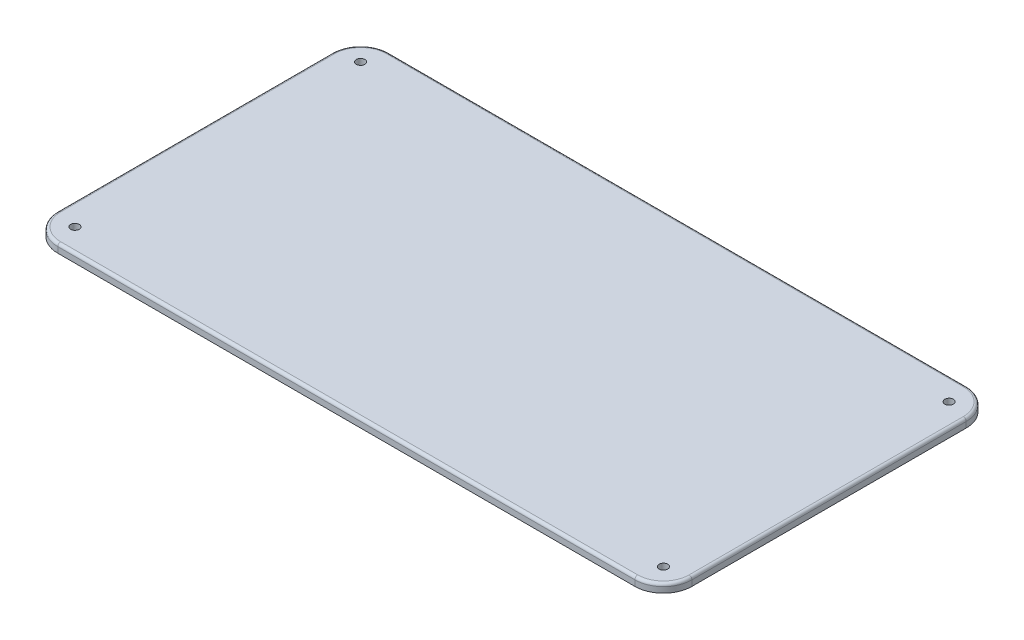
ISO-10303-21;
HEADER;
FILE_DESCRIPTION(('STEP AP214'),'2;1');
FILE_NAME('part.step','',(''),(''),'','','');
FILE_SCHEMA(('AUTOMOTIVE_DESIGN { 1 0 10303 214 1 1 1 1 }'));
ENDSEC;
DATA;
#1=APPLICATION_CONTEXT('core data for automotive mechanical design processes');
#2=APPLICATION_PROTOCOL_DEFINITION('international standard','automotive_design',2000,#1);
#3=PRODUCT_CONTEXT('',#1,'mechanical');
#4=PRODUCT('Part','Part','',(#3));
#5=PRODUCT_RELATED_PRODUCT_CATEGORY('part','',(#4));
#6=PRODUCT_DEFINITION_FORMATION('','',#4);
#7=PRODUCT_DEFINITION_CONTEXT('part definition',#1,'design');
#8=PRODUCT_DEFINITION('design','',#6,#7);
#9=PRODUCT_DEFINITION_SHAPE('','',#8);
#10=(LENGTH_UNIT() NAMED_UNIT(*) SI_UNIT(.MILLI.,.METRE.));
#11=(NAMED_UNIT(*) PLANE_ANGLE_UNIT() SI_UNIT($,.RADIAN.));
#12=(NAMED_UNIT(*) SI_UNIT($,.STERADIAN.) SOLID_ANGLE_UNIT());
#13=UNCERTAINTY_MEASURE_WITH_UNIT(LENGTH_MEASURE(1.E-05),#10,'distance_accuracy_value','');
#14=(GEOMETRIC_REPRESENTATION_CONTEXT(3) GLOBAL_UNCERTAINTY_ASSIGNED_CONTEXT((#13)) GLOBAL_UNIT_ASSIGNED_CONTEXT((#10,
#11,#12)) REPRESENTATION_CONTEXT('',''));
#15=CARTESIAN_POINT('',(0.,0.,0.));
#16=DIRECTION('',(0.,0.,1.));
#17=DIRECTION('',(1.,0.,0.));
#18=AXIS2_PLACEMENT_3D('',#15,#16,#17);
#19=CARTESIAN_POINT('',(7.00000000000006,60.,7.00000000000003));
#20=DIRECTION('',(0.,1.,0.));
#21=DIRECTION('',(0.,0.,1.));
#22=AXIS2_PLACEMENT_3D('',#19,#20,#21);
#23=PLANE('',#22);
#24=DIRECTION('',(0.,0.,1.));
#25=VECTOR('',#24,1.);
#26=CARTESIAN_POINT('',(-204.,60.,7.00000000000004));
#27=LINE('',#26,#25);
#28=CARTESIAN_POINT('',(-204.,60.,-89.));
#29=VERTEX_POINT('',#28);
#30=CARTESIAN_POINT('',(-204.,60.,7.00000000000004));
#31=VERTEX_POINT('',#30);
#32=EDGE_CURVE('E191',#29,#31,#27,.T.);
#33=ORIENTED_EDGE('',*,*,#32,.T.);
#34=CARTESIAN_POINT('',(-195.,60.,7.00000000000004));
#35=DIRECTION('',(0.,1.,0.));
#36=DIRECTION('',(0.,0.,1.));
#37=AXIS2_PLACEMENT_3D('',#34,#35,#36);
#38=CIRCLE('',#37,9.00000000000001);
#39=CARTESIAN_POINT('',(-195.,60.,16.));
#40=VERTEX_POINT('',#39);
#41=EDGE_CURVE('E193',#31,#40,#38,.T.);
#42=ORIENTED_EDGE('',*,*,#41,.T.);
#43=DIRECTION('',(1.,0.,0.));
#44=VECTOR('',#43,1.);
#45=CARTESIAN_POINT('',(7.00000000000006,60.,16.));
#46=LINE('',#45,#44);
#47=CARTESIAN_POINT('',(7.00000000000006,60.,16.));
#48=VERTEX_POINT('',#47);
#49=EDGE_CURVE('E129',#40,#48,#46,.T.);
#50=ORIENTED_EDGE('',*,*,#49,.T.);
#51=CARTESIAN_POINT('',(7.00000000000006,60.,7.00000000000003));
#52=DIRECTION('',(0.,1.,0.));
#53=DIRECTION('',(0.,0.,1.));
#54=AXIS2_PLACEMENT_3D('',#51,#52,#53);
#55=CIRCLE('',#54,9.);
#56=CARTESIAN_POINT('',(16.0000000000001,60.,7.00000000000003));
#57=VERTEX_POINT('',#56);
#58=EDGE_CURVE('E181',#48,#57,#55,.T.);
#59=ORIENTED_EDGE('',*,*,#58,.T.);
#60=DIRECTION('',(0.,0.,-1.));
#61=VECTOR('',#60,1.);
#62=CARTESIAN_POINT('',(16.0000000000001,60.,-89.));
#63=LINE('',#62,#61);
#64=CARTESIAN_POINT('',(16.0000000000001,60.,-89.));
#65=VERTEX_POINT('',#64);
#66=EDGE_CURVE('E183',#57,#65,#63,.T.);
#67=ORIENTED_EDGE('',*,*,#66,.T.);
#68=CARTESIAN_POINT('',(7.00000000000006,60.,-89.));
#69=DIRECTION('',(0.,1.,0.));
#70=DIRECTION('',(0.,0.,1.));
#71=AXIS2_PLACEMENT_3D('',#68,#69,#70);
#72=CIRCLE('',#71,9.);
#73=CARTESIAN_POINT('',(7.00000000000006,60.,-98.));
#74=VERTEX_POINT('',#73);
#75=EDGE_CURVE('E185',#65,#74,#72,.T.);
#76=ORIENTED_EDGE('',*,*,#75,.T.);
#77=DIRECTION('',(-1.,0.,0.));
#78=VECTOR('',#77,1.);
#79=CARTESIAN_POINT('',(-195.,60.,-98.));
#80=LINE('',#79,#78);
#81=CARTESIAN_POINT('',(-195.,60.,-98.));
#82=VERTEX_POINT('',#81);
#83=EDGE_CURVE('E187',#74,#82,#80,.T.);
#84=ORIENTED_EDGE('',*,*,#83,.T.);
#85=CARTESIAN_POINT('',(-195.,60.,-89.));
#86=DIRECTION('',(0.,1.,0.));
#87=DIRECTION('',(0.,0.,1.));
#88=AXIS2_PLACEMENT_3D('',#85,#86,#87);
#89=CIRCLE('',#88,9.);
#90=EDGE_CURVE('E189',#82,#29,#89,.T.);
#91=ORIENTED_EDGE('',*,*,#90,.T.);
#92=EDGE_LOOP('',(#33,#42,#50,#59,#67,#76,#84,#91));
#93=FACE_BOUND('',#92,.T.);
#94=CARTESIAN_POINT('',(9.00000000000007,60.,9.00000000000004));
#95=DIRECTION('',(0.,1.,0.));
#96=DIRECTION('',(0.,0.,1.));
#97=AXIS2_PLACEMENT_3D('',#94,#95,#96);
#98=CIRCLE('',#97,1.5);
#99=CARTESIAN_POINT('',(9.00000000000007,60.,10.5));
#100=VERTEX_POINT('',#99);
#101=EDGE_CURVE('E244',#100,#100,#98,.T.);
#102=ORIENTED_EDGE('',*,*,#101,.F.);
#103=EDGE_LOOP('',(#102));
#104=FACE_BOUND('',#103,.T.);
#105=CARTESIAN_POINT('',(-197.,60.,-91.));
#106=DIRECTION('',(0.,1.,0.));
#107=DIRECTION('',(0.,0.,1.));
#108=AXIS2_PLACEMENT_3D('',#105,#106,#107);
#109=CIRCLE('',#108,1.5);
#110=CARTESIAN_POINT('',(-197.,60.,-89.5));
#111=VERTEX_POINT('',#110);
#112=EDGE_CURVE('E147',#111,#111,#109,.T.);
#113=ORIENTED_EDGE('',*,*,#112,.F.);
#114=EDGE_LOOP('',(#113));
#115=FACE_BOUND('',#114,.T.);
#116=CARTESIAN_POINT('',(9.00000000000007,60.,-91.));
#117=DIRECTION('',(0.,1.,0.));
#118=DIRECTION('',(0.,0.,1.));
#119=AXIS2_PLACEMENT_3D('',#116,#117,#118);
#120=CIRCLE('',#119,1.5);
#121=CARTESIAN_POINT('',(9.00000000000007,60.,-89.5));
#122=VERTEX_POINT('',#121);
#123=EDGE_CURVE('E250',#122,#122,#120,.T.);
#124=ORIENTED_EDGE('',*,*,#123,.F.);
#125=EDGE_LOOP('',(#124));
#126=FACE_BOUND('',#125,.T.);
#127=CARTESIAN_POINT('',(-197.,60.,9.00000000000004));
#128=DIRECTION('',(0.,1.,0.));
#129=DIRECTION('',(0.,0.,1.));
#130=AXIS2_PLACEMENT_3D('',#127,#128,#129);
#131=CIRCLE('',#130,1.5);
#132=CARTESIAN_POINT('',(-197.,60.,10.5));
#133=VERTEX_POINT('',#132);
#134=EDGE_CURVE('E236',#133,#133,#131,.T.);
#135=ORIENTED_EDGE('',*,*,#134,.F.);
#136=EDGE_LOOP('',(#135));
#137=FACE_BOUND('',#136,.T.);
#138=ADVANCED_FACE('F33',(#93,#104,#115,#126,#137),#23,.T.);
#139=CARTESIAN_POINT('',(7.00000000000006,57.,7.00000000000003));
#140=DIRECTION('',(0.,1.,0.));
#141=DIRECTION('',(0.,0.,1.));
#142=AXIS2_PLACEMENT_3D('',#139,#140,#141);
#143=PLANE('',#142);
#144=CARTESIAN_POINT('',(7.00000000000006,57.,7.00000000000003));
#145=DIRECTION('',(0.,1.,0.));
#146=DIRECTION('',(0.,0.,1.));
#147=AXIS2_PLACEMENT_3D('',#144,#145,#146);
#148=CIRCLE('',#147,10.);
#149=CARTESIAN_POINT('',(7.00000000000006,57.,17.));
#150=VERTEX_POINT('',#149);
#151=CARTESIAN_POINT('',(17.0000000000001,57.,7.00000000000003));
#152=VERTEX_POINT('',#151);
#153=EDGE_CURVE('E125',#150,#152,#148,.T.);
#154=ORIENTED_EDGE('',*,*,#153,.F.);
#155=DIRECTION('',(1.,0.,0.));
#156=VECTOR('',#155,1.);
#157=CARTESIAN_POINT('',(-31.5,57.,17.));
#158=LINE('',#157,#156);
#159=CARTESIAN_POINT('',(-195.,57.,17.));
#160=VERTEX_POINT('',#159);
#161=EDGE_CURVE('E133',#160,#150,#158,.T.);
#162=ORIENTED_EDGE('',*,*,#161,.F.);
#163=CARTESIAN_POINT('',(-195.,57.,7.00000000000004));
#164=DIRECTION('',(0.,1.,0.));
#165=DIRECTION('',(0.,0.,1.));
#166=AXIS2_PLACEMENT_3D('',#163,#164,#165);
#167=CIRCLE('',#166,10.);
#168=CARTESIAN_POINT('',(-205.,57.,7.00000000000004));
#169=VERTEX_POINT('',#168);
#170=EDGE_CURVE('E140',#169,#160,#167,.T.);
#171=ORIENTED_EDGE('',*,*,#170,.F.);
#172=DIRECTION('',(0.,0.,1.));
#173=VECTOR('',#172,1.);
#174=CARTESIAN_POINT('',(-205.,57.,-89.));
#175=LINE('',#174,#173);
#176=CARTESIAN_POINT('',(-205.,57.,-89.));
#177=VERTEX_POINT('',#176);
#178=EDGE_CURVE('E164',#177,#169,#175,.T.);
#179=ORIENTED_EDGE('',*,*,#178,.F.);
#180=CARTESIAN_POINT('',(-195.,57.,-89.));
#181=DIRECTION('',(0.,1.,0.));
#182=DIRECTION('',(0.,0.,1.));
#183=AXIS2_PLACEMENT_3D('',#180,#181,#182);
#184=CIRCLE('',#183,10.);
#185=CARTESIAN_POINT('',(-195.,57.,-99.));
#186=VERTEX_POINT('',#185);
#187=EDGE_CURVE('E161',#186,#177,#184,.T.);
#188=ORIENTED_EDGE('',*,*,#187,.F.);
#189=DIRECTION('',(-1.,0.,0.));
#190=VECTOR('',#189,1.);
#191=CARTESIAN_POINT('',(7.00000000000006,57.,-99.));
#192=LINE('',#191,#190);
#193=CARTESIAN_POINT('',(7.00000000000006,57.,-99.));
#194=VERTEX_POINT('',#193);
#195=EDGE_CURVE('E158',#194,#186,#192,.T.);
#196=ORIENTED_EDGE('',*,*,#195,.F.);
#197=CARTESIAN_POINT('',(7.00000000000006,57.,-89.));
#198=DIRECTION('',(0.,1.,0.));
#199=DIRECTION('',(0.,0.,1.));
#200=AXIS2_PLACEMENT_3D('',#197,#198,#199);
#201=CIRCLE('',#200,10.);
#202=CARTESIAN_POINT('',(17.0000000000001,57.,-89.));
#203=VERTEX_POINT('',#202);
#204=EDGE_CURVE('E149',#203,#194,#201,.T.);
#205=ORIENTED_EDGE('',*,*,#204,.F.);
#206=DIRECTION('',(0.,0.,-1.));
#207=VECTOR('',#206,1.);
#208=CARTESIAN_POINT('',(17.0000000000001,57.,7.00000000000003));
#209=LINE('',#208,#207);
#210=EDGE_CURVE('E146',#152,#203,#209,.T.);
#211=ORIENTED_EDGE('',*,*,#210,.F.);
#212=EDGE_LOOP('',(#154,#162,#171,#179,#188,#196,#205,#211));
#213=FACE_BOUND('',#212,.T.);
#214=CARTESIAN_POINT('',(-197.,57.,-91.));
#215=DIRECTION('',(0.,1.,0.));
#216=DIRECTION('',(0.,0.,1.));
#217=AXIS2_PLACEMENT_3D('',#214,#215,#216);
#218=CIRCLE('',#217,1.5);
#219=CARTESIAN_POINT('',(-197.,57.,-89.5));
#220=VERTEX_POINT('',#219);
#221=EDGE_CURVE('E152',#220,#220,#218,.T.);
#222=ORIENTED_EDGE('',*,*,#221,.T.);
#223=EDGE_LOOP('',(#222));
#224=FACE_BOUND('',#223,.T.);
#225=CARTESIAN_POINT('',(9.00000000000007,57.,-91.));
#226=DIRECTION('',(0.,1.,0.));
#227=DIRECTION('',(0.,0.,1.));
#228=AXIS2_PLACEMENT_3D('',#225,#226,#227);
#229=CIRCLE('',#228,1.5);
#230=CARTESIAN_POINT('',(9.00000000000007,57.,-89.5));
#231=VERTEX_POINT('',#230);
#232=EDGE_CURVE('E247',#231,#231,#229,.T.);
#233=ORIENTED_EDGE('',*,*,#232,.T.);
#234=EDGE_LOOP('',(#233));
#235=FACE_BOUND('',#234,.T.);
#236=CARTESIAN_POINT('',(9.00000000000007,57.,9.00000000000004));
#237=DIRECTION('',(0.,1.,0.));
#238=DIRECTION('',(0.,0.,1.));
#239=AXIS2_PLACEMENT_3D('',#236,#237,#238);
#240=CIRCLE('',#239,1.5);
#241=CARTESIAN_POINT('',(9.00000000000007,57.,10.5));
#242=VERTEX_POINT('',#241);
#243=EDGE_CURVE('E241',#242,#242,#240,.T.);
#244=ORIENTED_EDGE('',*,*,#243,.T.);
#245=EDGE_LOOP('',(#244));
#246=FACE_BOUND('',#245,.T.);
#247=CARTESIAN_POINT('',(-197.,57.,9.00000000000004));
#248=DIRECTION('',(0.,1.,0.));
#249=DIRECTION('',(0.,0.,1.));
#250=AXIS2_PLACEMENT_3D('',#247,#248,#249);
#251=CIRCLE('',#250,1.5);
#252=CARTESIAN_POINT('',(-197.,57.,10.5));
#253=VERTEX_POINT('',#252);
#254=EDGE_CURVE('E230',#253,#253,#251,.T.);
#255=ORIENTED_EDGE('',*,*,#254,.T.);
#256=EDGE_LOOP('',(#255));
#257=FACE_BOUND('',#256,.T.);
#258=ADVANCED_FACE('F142',(#213,#224,#235,#246,#257),#143,.F.);
#259=CARTESIAN_POINT('',(7.00000000000006,60.,7.00000000000003));
#260=DIRECTION('',(0.,-1.,0.));
#261=DIRECTION('',(0.,0.,-1.));
#262=AXIS2_PLACEMENT_3D('',#259,#260,#261);
#263=CYLINDRICAL_SURFACE('',#262,10.);
#264=DIRECTION('',(0.,-1.,0.));
#265=VECTOR('',#264,1.);
#266=CARTESIAN_POINT('',(17.0000000000001,60.,7.00000000000003));
#267=LINE('',#266,#265);
#268=CARTESIAN_POINT('',(17.0000000000001,59.,7.00000000000003));
#269=VERTEX_POINT('',#268);
#270=EDGE_CURVE('E130',#269,#152,#267,.T.);
#271=ORIENTED_EDGE('',*,*,#270,.F.);
#272=CARTESIAN_POINT('',(7.00000000000006,59.,7.00000000000003));
#273=DIRECTION('',(0.,1.,0.));
#274=DIRECTION('',(0.,0.,1.));
#275=AXIS2_PLACEMENT_3D('',#272,#273,#274);
#276=CIRCLE('',#275,10.);
#277=CARTESIAN_POINT('',(7.00000000000006,59.,17.));
#278=VERTEX_POINT('',#277);
#279=EDGE_CURVE('E42',#269,#278,#276,.F.);
#280=ORIENTED_EDGE('',*,*,#279,.T.);
#281=DIRECTION('',(0.,-1.,0.));
#282=VECTOR('',#281,1.);
#283=CARTESIAN_POINT('',(7.00000000000006,60.,17.));
#284=LINE('',#283,#282);
#285=EDGE_CURVE('E121',#278,#150,#284,.T.);
#286=ORIENTED_EDGE('',*,*,#285,.T.);
#287=ORIENTED_EDGE('',*,*,#153,.T.);
#288=EDGE_LOOP('',(#271,#280,#286,#287));
#289=FACE_BOUND('',#288,.T.);
#290=ADVANCED_FACE('F123',(#289),#263,.T.);
#291=CARTESIAN_POINT('',(17.0000000000001,60.,7.00000000000003));
#292=DIRECTION('',(-1.,0.,0.));
#293=DIRECTION('',(0.,0.,1.));
#294=AXIS2_PLACEMENT_3D('',#291,#292,#293);
#295=PLANE('',#294);
#296=DIRECTION('',(0.,-1.,0.));
#297=VECTOR('',#296,1.);
#298=CARTESIAN_POINT('',(17.0000000000001,60.,-89.));
#299=LINE('',#298,#297);
#300=CARTESIAN_POINT('',(17.0000000000001,59.,-89.));
#301=VERTEX_POINT('',#300);
#302=EDGE_CURVE('E177',#301,#203,#299,.T.);
#303=ORIENTED_EDGE('',*,*,#302,.F.);
#304=DIRECTION('',(0.,0.,-1.));
#305=VECTOR('',#304,1.);
#306=CARTESIAN_POINT('',(17.0000000000001,59.,7.00000000000003));
#307=LINE('',#306,#305);
#308=EDGE_CURVE('E57',#301,#269,#307,.F.);
#309=ORIENTED_EDGE('',*,*,#308,.T.);
#310=ORIENTED_EDGE('',*,*,#270,.T.);
#311=ORIENTED_EDGE('',*,*,#210,.T.);
#312=EDGE_LOOP('',(#303,#309,#310,#311));
#313=FACE_BOUND('',#312,.T.);
#314=ADVANCED_FACE('F303',(#313),#295,.F.);
#315=CARTESIAN_POINT('',(7.00000000000006,60.,-89.));
#316=DIRECTION('',(0.,-1.,0.));
#317=DIRECTION('',(0.,0.,-1.));
#318=AXIS2_PLACEMENT_3D('',#315,#316,#317);
#319=CYLINDRICAL_SURFACE('',#318,10.);
#320=DIRECTION('',(0.,-1.,0.));
#321=VECTOR('',#320,1.);
#322=CARTESIAN_POINT('',(7.00000000000006,60.,-99.));
#323=LINE('',#322,#321);
#324=CARTESIAN_POINT('',(7.00000000000006,59.,-99.));
#325=VERTEX_POINT('',#324);
#326=EDGE_CURVE('E175',#325,#194,#323,.T.);
#327=ORIENTED_EDGE('',*,*,#326,.F.);
#328=CARTESIAN_POINT('',(7.00000000000006,59.,-89.));
#329=DIRECTION('',(0.,1.,0.));
#330=DIRECTION('',(0.,0.,1.));
#331=AXIS2_PLACEMENT_3D('',#328,#329,#330);
#332=CIRCLE('',#331,10.);
#333=EDGE_CURVE('E205',#325,#301,#332,.F.);
#334=ORIENTED_EDGE('',*,*,#333,.T.);
#335=ORIENTED_EDGE('',*,*,#302,.T.);
#336=ORIENTED_EDGE('',*,*,#204,.T.);
#337=EDGE_LOOP('',(#327,#334,#335,#336));
#338=FACE_BOUND('',#337,.T.);
#339=ADVANCED_FACE('F299',(#338),#319,.T.);
#340=CARTESIAN_POINT('',(7.00000000000006,60.,-99.));
#341=DIRECTION('',(0.,0.,1.));
#342=DIRECTION('',(0.,-1.,0.));
#343=AXIS2_PLACEMENT_3D('',#340,#341,#342);
#344=PLANE('',#343);
#345=DIRECTION('',(0.,-1.,0.));
#346=VECTOR('',#345,1.);
#347=CARTESIAN_POINT('',(-195.,60.,-99.));
#348=LINE('',#347,#346);
#349=CARTESIAN_POINT('',(-195.,59.,-99.));
#350=VERTEX_POINT('',#349);
#351=EDGE_CURVE('E173',#350,#186,#348,.T.);
#352=ORIENTED_EDGE('',*,*,#351,.F.);
#353=DIRECTION('',(-1.,0.,0.));
#354=VECTOR('',#353,1.);
#355=CARTESIAN_POINT('',(7.00000000000006,59.,-99.));
#356=LINE('',#355,#354);
#357=EDGE_CURVE('E203',#350,#325,#356,.F.);
#358=ORIENTED_EDGE('',*,*,#357,.T.);
#359=ORIENTED_EDGE('',*,*,#326,.T.);
#360=ORIENTED_EDGE('',*,*,#195,.T.);
#361=EDGE_LOOP('',(#352,#358,#359,#360));
#362=FACE_BOUND('',#361,.T.);
#363=ADVANCED_FACE('F295',(#362),#344,.F.);
#364=CARTESIAN_POINT('',(-195.,60.,-89.));
#365=DIRECTION('',(0.,-1.,0.));
#366=DIRECTION('',(0.,0.,-1.));
#367=AXIS2_PLACEMENT_3D('',#364,#365,#366);
#368=CYLINDRICAL_SURFACE('',#367,10.);
#369=DIRECTION('',(0.,-1.,0.));
#370=VECTOR('',#369,1.);
#371=CARTESIAN_POINT('',(-205.,60.,-89.));
#372=LINE('',#371,#370);
#373=CARTESIAN_POINT('',(-205.,59.,-89.));
#374=VERTEX_POINT('',#373);
#375=EDGE_CURVE('E171',#374,#177,#372,.T.);
#376=ORIENTED_EDGE('',*,*,#375,.F.);
#377=CARTESIAN_POINT('',(-195.,59.,-89.));
#378=DIRECTION('',(0.,1.,0.));
#379=DIRECTION('',(0.,0.,1.));
#380=AXIS2_PLACEMENT_3D('',#377,#378,#379);
#381=CIRCLE('',#380,10.);
#382=EDGE_CURVE('E201',#374,#350,#381,.F.);
#383=ORIENTED_EDGE('',*,*,#382,.T.);
#384=ORIENTED_EDGE('',*,*,#351,.T.);
#385=ORIENTED_EDGE('',*,*,#187,.T.);
#386=EDGE_LOOP('',(#376,#383,#384,#385));
#387=FACE_BOUND('',#386,.T.);
#388=ADVANCED_FACE('F291',(#387),#368,.T.);
#389=CARTESIAN_POINT('',(-205.,60.,-89.));
#390=DIRECTION('',(1.,0.,0.));
#391=DIRECTION('',(0.,1.,0.));
#392=AXIS2_PLACEMENT_3D('',#389,#390,#391);
#393=PLANE('',#392);
#394=DIRECTION('',(0.,-1.,0.));
#395=VECTOR('',#394,1.);
#396=CARTESIAN_POINT('',(-205.,60.,7.00000000000004));
#397=LINE('',#396,#395);
#398=CARTESIAN_POINT('',(-205.,59.,7.00000000000004));
#399=VERTEX_POINT('',#398);
#400=EDGE_CURVE('E169',#399,#169,#397,.T.);
#401=ORIENTED_EDGE('',*,*,#400,.F.);
#402=DIRECTION('',(0.,0.,1.));
#403=VECTOR('',#402,1.);
#404=CARTESIAN_POINT('',(-205.,59.,-89.));
#405=LINE('',#404,#403);
#406=EDGE_CURVE('E199',#399,#374,#405,.F.);
#407=ORIENTED_EDGE('',*,*,#406,.T.);
#408=ORIENTED_EDGE('',*,*,#375,.T.);
#409=ORIENTED_EDGE('',*,*,#178,.T.);
#410=EDGE_LOOP('',(#401,#407,#408,#409));
#411=FACE_BOUND('',#410,.T.);
#412=ADVANCED_FACE('F287',(#411),#393,.F.);
#413=CARTESIAN_POINT('',(-195.,60.,7.00000000000004));
#414=DIRECTION('',(0.,-1.,0.));
#415=DIRECTION('',(0.,0.,-1.));
#416=AXIS2_PLACEMENT_3D('',#413,#414,#415);
#417=CYLINDRICAL_SURFACE('',#416,10.);
#418=DIRECTION('',(0.,-1.,0.));
#419=VECTOR('',#418,1.);
#420=CARTESIAN_POINT('',(-195.,60.,17.));
#421=LINE('',#420,#419);
#422=CARTESIAN_POINT('',(-195.,59.,17.));
#423=VERTEX_POINT('',#422);
#424=EDGE_CURVE('E136',#423,#160,#421,.T.);
#425=ORIENTED_EDGE('',*,*,#424,.F.);
#426=CARTESIAN_POINT('',(-195.,59.,7.00000000000004));
#427=DIRECTION('',(0.,1.,0.));
#428=DIRECTION('',(0.,0.,1.));
#429=AXIS2_PLACEMENT_3D('',#426,#427,#428);
#430=CIRCLE('',#429,10.);
#431=EDGE_CURVE('E196',#423,#399,#430,.F.);
#432=ORIENTED_EDGE('',*,*,#431,.T.);
#433=ORIENTED_EDGE('',*,*,#400,.T.);
#434=ORIENTED_EDGE('',*,*,#170,.T.);
#435=EDGE_LOOP('',(#425,#432,#433,#434));
#436=FACE_BOUND('',#435,.T.);
#437=ADVANCED_FACE('F284',(#436),#417,.T.);
#438=CARTESIAN_POINT('',(-31.5,60.,17.));
#439=DIRECTION('',(0.,0.,-1.));
#440=DIRECTION('',(0.,1.,0.));
#441=AXIS2_PLACEMENT_3D('',#438,#439,#440);
#442=PLANE('',#441);
#443=ORIENTED_EDGE('',*,*,#285,.F.);
#444=DIRECTION('',(1.,0.,0.));
#445=VECTOR('',#444,1.);
#446=CARTESIAN_POINT('',(-195.,59.,17.));
#447=LINE('',#446,#445);
#448=EDGE_CURVE('E11',#278,#423,#447,.F.);
#449=ORIENTED_EDGE('',*,*,#448,.T.);
#450=ORIENTED_EDGE('',*,*,#424,.T.);
#451=ORIENTED_EDGE('',*,*,#161,.T.);
#452=EDGE_LOOP('',(#443,#449,#450,#451));
#453=FACE_BOUND('',#452,.T.);
#454=ADVANCED_FACE('F134',(#453),#442,.F.);
#455=CARTESIAN_POINT('',(-197.,60.,-91.));
#456=DIRECTION('',(0.,-1.,0.));
#457=DIRECTION('',(0.,0.,-1.));
#458=AXIS2_PLACEMENT_3D('',#455,#456,#457);
#459=CYLINDRICAL_SURFACE('',#458,1.5);
#460=ORIENTED_EDGE('',*,*,#112,.T.);
#461=EDGE_LOOP('',(#460));
#462=FACE_BOUND('',#461,.T.);
#463=ORIENTED_EDGE('',*,*,#221,.F.);
#464=EDGE_LOOP('',(#463));
#465=FACE_BOUND('',#464,.T.);
#466=ADVANCED_FACE('F261',(#462,#465),#459,.F.);
#467=CARTESIAN_POINT('',(9.00000000000007,60.,-91.));
#468=DIRECTION('',(0.,-1.,0.));
#469=DIRECTION('',(0.,0.,-1.));
#470=AXIS2_PLACEMENT_3D('',#467,#468,#469);
#471=CYLINDRICAL_SURFACE('',#470,1.5);
#472=ORIENTED_EDGE('',*,*,#123,.T.);
#473=EDGE_LOOP('',(#472));
#474=FACE_BOUND('',#473,.T.);
#475=ORIENTED_EDGE('',*,*,#232,.F.);
#476=EDGE_LOOP('',(#475));
#477=FACE_BOUND('',#476,.T.);
#478=ADVANCED_FACE('F258',(#474,#477),#471,.F.);
#479=CARTESIAN_POINT('',(9.00000000000007,60.,9.00000000000004));
#480=DIRECTION('',(0.,-1.,0.));
#481=DIRECTION('',(0.,0.,-1.));
#482=AXIS2_PLACEMENT_3D('',#479,#480,#481);
#483=CYLINDRICAL_SURFACE('',#482,1.5);
#484=ORIENTED_EDGE('',*,*,#101,.T.);
#485=EDGE_LOOP('',(#484));
#486=FACE_BOUND('',#485,.T.);
#487=ORIENTED_EDGE('',*,*,#243,.F.);
#488=EDGE_LOOP('',(#487));
#489=FACE_BOUND('',#488,.T.);
#490=ADVANCED_FACE('F260',(#486,#489),#483,.F.);
#491=CARTESIAN_POINT('',(-197.,60.,9.00000000000004));
#492=DIRECTION('',(0.,-1.,0.));
#493=DIRECTION('',(0.,0.,-1.));
#494=AXIS2_PLACEMENT_3D('',#491,#492,#493);
#495=CYLINDRICAL_SURFACE('',#494,1.5);
#496=ORIENTED_EDGE('',*,*,#134,.T.);
#497=EDGE_LOOP('',(#496));
#498=FACE_BOUND('',#497,.T.);
#499=ORIENTED_EDGE('',*,*,#254,.F.);
#500=EDGE_LOOP('',(#499));
#501=FACE_BOUND('',#500,.T.);
#502=ADVANCED_FACE('F268',(#498,#501),#495,.F.);
#503=CARTESIAN_POINT('',(7.00000000000006,59.,-89.));
#504=DIRECTION('',(0.,1.,0.));
#505=DIRECTION('',(0.,0.,1.));
#506=AXIS2_PLACEMENT_3D('',#503,#504,#505);
#507=TOROIDAL_SURFACE('',#506,9.,1.);
#508=CARTESIAN_POINT('',(16.0000000000001,59.,-89.));
#509=DIRECTION('',(0.,0.,1.));
#510=DIRECTION('',(1.,0.,0.));
#511=AXIS2_PLACEMENT_3D('',#508,#509,#510);
#512=CIRCLE('',#511,1.);
#513=EDGE_CURVE('E224',#301,#65,#512,.T.);
#514=ORIENTED_EDGE('',*,*,#513,.F.);
#515=ORIENTED_EDGE('',*,*,#333,.F.);
#516=CARTESIAN_POINT('',(7.00000000000006,59.,-98.));
#517=DIRECTION('',(-1.,0.,0.));
#518=DIRECTION('',(0.,0.,1.));
#519=AXIS2_PLACEMENT_3D('',#516,#517,#518);
#520=CIRCLE('',#519,1.);
#521=EDGE_CURVE('E37',#74,#325,#520,.T.);
#522=ORIENTED_EDGE('',*,*,#521,.F.);
#523=ORIENTED_EDGE('',*,*,#75,.F.);
#524=EDGE_LOOP('',(#514,#515,#522,#523));
#525=FACE_BOUND('',#524,.T.);
#526=ADVANCED_FACE('F35',(#525),#507,.T.);
#527=CARTESIAN_POINT('',(7.00000000000006,59.,-98.));
#528=DIRECTION('',(1.,0.,0.));
#529=DIRECTION('',(0.,1.,0.));
#530=AXIS2_PLACEMENT_3D('',#527,#528,#529);
#531=CYLINDRICAL_SURFACE('',#530,1.);
#532=ORIENTED_EDGE('',*,*,#521,.T.);
#533=ORIENTED_EDGE('',*,*,#357,.F.);
#534=CARTESIAN_POINT('',(-195.,59.,-98.));
#535=DIRECTION('',(-1.,0.,0.));
#536=DIRECTION('',(0.,0.,1.));
#537=AXIS2_PLACEMENT_3D('',#534,#535,#536);
#538=CIRCLE('',#537,1.);
#539=EDGE_CURVE('E222',#82,#350,#538,.T.);
#540=ORIENTED_EDGE('',*,*,#539,.F.);
#541=ORIENTED_EDGE('',*,*,#83,.F.);
#542=EDGE_LOOP('',(#532,#533,#540,#541));
#543=FACE_BOUND('',#542,.T.);
#544=ADVANCED_FACE('F331',(#543),#531,.T.);
#545=CARTESIAN_POINT('',(16.0000000000001,59.,7.00000000000003));
#546=DIRECTION('',(0.,0.,1.));
#547=DIRECTION('',(0.,-1.,0.));
#548=AXIS2_PLACEMENT_3D('',#545,#546,#547);
#549=CYLINDRICAL_SURFACE('',#548,1.);
#550=ORIENTED_EDGE('',*,*,#513,.T.);
#551=ORIENTED_EDGE('',*,*,#66,.F.);
#552=CARTESIAN_POINT('',(16.0000000000001,59.,7.00000000000003));
#553=DIRECTION('',(0.,0.,1.));
#554=DIRECTION('',(1.,0.,0.));
#555=AXIS2_PLACEMENT_3D('',#552,#553,#554);
#556=CIRCLE('',#555,1.);
#557=EDGE_CURVE('E219',#269,#57,#556,.T.);
#558=ORIENTED_EDGE('',*,*,#557,.F.);
#559=ORIENTED_EDGE('',*,*,#308,.F.);
#560=EDGE_LOOP('',(#550,#551,#558,#559));
#561=FACE_BOUND('',#560,.T.);
#562=ADVANCED_FACE('F328',(#561),#549,.T.);
#563=CARTESIAN_POINT('',(-195.,59.,-89.));
#564=DIRECTION('',(0.,1.,0.));
#565=DIRECTION('',(0.,0.,1.));
#566=AXIS2_PLACEMENT_3D('',#563,#564,#565);
#567=TOROIDAL_SURFACE('',#566,9.,1.);
#568=ORIENTED_EDGE('',*,*,#539,.T.);
#569=ORIENTED_EDGE('',*,*,#382,.F.);
#570=CARTESIAN_POINT('',(-204.,59.,-89.));
#571=DIRECTION('',(0.,0.,1.));
#572=DIRECTION('',(1.,0.,0.));
#573=AXIS2_PLACEMENT_3D('',#570,#571,#572);
#574=CIRCLE('',#573,1.);
#575=EDGE_CURVE('E216',#29,#374,#574,.T.);
#576=ORIENTED_EDGE('',*,*,#575,.F.);
#577=ORIENTED_EDGE('',*,*,#90,.F.);
#578=EDGE_LOOP('',(#568,#569,#576,#577));
#579=FACE_BOUND('',#578,.T.);
#580=ADVANCED_FACE('F324',(#579),#567,.T.);
#581=CARTESIAN_POINT('',(7.00000000000006,59.,7.00000000000003));
#582=DIRECTION('',(0.,1.,0.));
#583=DIRECTION('',(0.,0.,1.));
#584=AXIS2_PLACEMENT_3D('',#581,#582,#583);
#585=TOROIDAL_SURFACE('',#584,9.,1.);
#586=ORIENTED_EDGE('',*,*,#557,.T.);
#587=ORIENTED_EDGE('',*,*,#58,.F.);
#588=CARTESIAN_POINT('',(7.00000000000006,59.,16.));
#589=DIRECTION('',(-1.,0.,0.));
#590=DIRECTION('',(0.,0.,1.));
#591=AXIS2_PLACEMENT_3D('',#588,#589,#590);
#592=CIRCLE('',#591,1.);
#593=EDGE_CURVE('E213',#278,#48,#592,.T.);
#594=ORIENTED_EDGE('',*,*,#593,.F.);
#595=ORIENTED_EDGE('',*,*,#279,.F.);
#596=EDGE_LOOP('',(#586,#587,#594,#595));
#597=FACE_BOUND('',#596,.T.);
#598=ADVANCED_FACE('F320',(#597),#585,.T.);
#599=CARTESIAN_POINT('',(-204.,59.,7.00000000000003));
#600=DIRECTION('',(0.,0.,-1.));
#601=DIRECTION('',(0.,1.,0.));
#602=AXIS2_PLACEMENT_3D('',#599,#600,#601);
#603=CYLINDRICAL_SURFACE('',#602,1.);
#604=ORIENTED_EDGE('',*,*,#575,.T.);
#605=ORIENTED_EDGE('',*,*,#406,.F.);
#606=CARTESIAN_POINT('',(-204.,59.,7.00000000000004));
#607=DIRECTION('',(0.,0.,1.));
#608=DIRECTION('',(1.,0.,0.));
#609=AXIS2_PLACEMENT_3D('',#606,#607,#608);
#610=CIRCLE('',#609,1.);
#611=EDGE_CURVE('E211',#31,#399,#610,.T.);
#612=ORIENTED_EDGE('',*,*,#611,.F.);
#613=ORIENTED_EDGE('',*,*,#32,.F.);
#614=EDGE_LOOP('',(#604,#605,#612,#613));
#615=FACE_BOUND('',#614,.T.);
#616=ADVANCED_FACE('F316',(#615),#603,.T.);
#617=CARTESIAN_POINT('',(7.00000000000006,59.,16.));
#618=DIRECTION('',(-1.,0.,0.));
#619=DIRECTION('',(0.,-1.,0.));
#620=AXIS2_PLACEMENT_3D('',#617,#618,#619);
#621=CYLINDRICAL_SURFACE('',#620,1.);
#622=ORIENTED_EDGE('',*,*,#593,.T.);
#623=ORIENTED_EDGE('',*,*,#49,.F.);
#624=CARTESIAN_POINT('',(-195.,59.,16.));
#625=DIRECTION('',(-1.,0.,0.));
#626=DIRECTION('',(0.,0.,1.));
#627=AXIS2_PLACEMENT_3D('',#624,#625,#626);
#628=CIRCLE('',#627,1.);
#629=EDGE_CURVE('E209',#423,#40,#628,.T.);
#630=ORIENTED_EDGE('',*,*,#629,.F.);
#631=ORIENTED_EDGE('',*,*,#448,.F.);
#632=EDGE_LOOP('',(#622,#623,#630,#631));
#633=FACE_BOUND('',#632,.T.);
#634=ADVANCED_FACE('F312',(#633),#621,.T.);
#635=CARTESIAN_POINT('',(-195.,59.,7.00000000000004));
#636=DIRECTION('',(0.,1.,0.));
#637=DIRECTION('',(0.,0.,1.));
#638=AXIS2_PLACEMENT_3D('',#635,#636,#637);
#639=TOROIDAL_SURFACE('',#638,9.00000000000001,1.);
#640=ORIENTED_EDGE('',*,*,#611,.T.);
#641=ORIENTED_EDGE('',*,*,#431,.F.);
#642=ORIENTED_EDGE('',*,*,#629,.T.);
#643=ORIENTED_EDGE('',*,*,#41,.F.);
#644=EDGE_LOOP('',(#640,#641,#642,#643));
#645=FACE_BOUND('',#644,.T.);
#646=ADVANCED_FACE('F309',(#645),#639,.T.);
#647=CLOSED_SHELL('',(#138,#258,#290,#314,#339,#363,#388,#412,#437,#454,#466,#478,#490,#502,
#526,#544,#562,#580,#598,#616,#634,#646));
#648=MANIFOLD_SOLID_BREP('B2',#647);
#649=ADVANCED_BREP_SHAPE_REPRESENTATION('',(#18,#648),#14);
#650=SHAPE_DEFINITION_REPRESENTATION(#9,#649);
ENDSEC;
END-ISO-10303-21;
